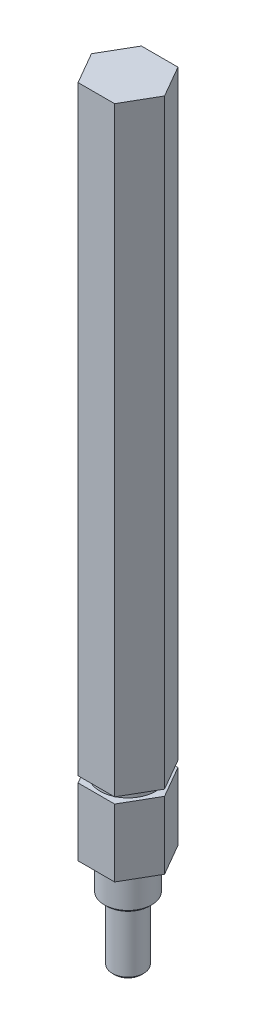
ISO-10303-21;
HEADER;
FILE_DESCRIPTION(('STEP AP214'),'2;1');
FILE_NAME('part.step','',(''),(''),'','','');
FILE_SCHEMA(('AUTOMOTIVE_DESIGN { 1 0 10303 214 1 1 1 1 }'));
ENDSEC;
DATA;
#1=APPLICATION_CONTEXT('core data for automotive mechanical design processes');
#2=APPLICATION_PROTOCOL_DEFINITION('international standard','automotive_design',2000,#1);
#3=PRODUCT_CONTEXT('',#1,'mechanical');
#4=PRODUCT('Part','Part','',(#3));
#5=PRODUCT_RELATED_PRODUCT_CATEGORY('part','',(#4));
#6=PRODUCT_DEFINITION_FORMATION('','',#4);
#7=PRODUCT_DEFINITION_CONTEXT('part definition',#1,'design');
#8=PRODUCT_DEFINITION('design','',#6,#7);
#9=PRODUCT_DEFINITION_SHAPE('','',#8);
#10=(LENGTH_UNIT() NAMED_UNIT(*) SI_UNIT(.MILLI.,.METRE.));
#11=(NAMED_UNIT(*) PLANE_ANGLE_UNIT() SI_UNIT($,.RADIAN.));
#12=(NAMED_UNIT(*) SI_UNIT($,.STERADIAN.) SOLID_ANGLE_UNIT());
#13=UNCERTAINTY_MEASURE_WITH_UNIT(LENGTH_MEASURE(1.E-05),#10,'distance_accuracy_value','');
#14=(GEOMETRIC_REPRESENTATION_CONTEXT(3) GLOBAL_UNCERTAINTY_ASSIGNED_CONTEXT((#13)) GLOBAL_UNIT_ASSIGNED_CONTEXT((#10,
#11,#12)) REPRESENTATION_CONTEXT('',''));
#15=CARTESIAN_POINT('',(0.,0.,0.));
#16=DIRECTION('',(0.,0.,1.));
#17=DIRECTION('',(1.,0.,0.));
#18=AXIS2_PLACEMENT_3D('',#15,#16,#17);
#19=CARTESIAN_POINT('',(-35.1448337161431,-92.2782,-16.6690116463021));
#20=DIRECTION('',(0.,-1.,0.));
#21=DIRECTION('',(0.,0.,-1.));
#22=AXIS2_PLACEMENT_3D('',#19,#20,#21);
#23=PLANE('',#22);
#24=CARTESIAN_POINT('',(-38.3071337161432,-92.2782000000097,-16.669011646302));
#25=DIRECTION('',(0.,1.,0.));
#26=DIRECTION('',(0.,0.,1.));
#27=AXIS2_PLACEMENT_3D('',#24,#25,#26);
#28=CIRCLE('',#27,2.65430000003342);
#29=CARTESIAN_POINT('',(-38.3071337161432,-92.2782000000097,-14.0147116462686));
#30=VERTEX_POINT('',#29);
#31=EDGE_CURVE('E19',#30,#30,#28,.T.);
#32=ORIENTED_EDGE('',*,*,#31,.F.);
#33=EDGE_LOOP('',(#32));
#34=FACE_BOUND('',#33,.T.);
#35=ADVANCED_FACE('F16',(#34),#23,.T.);
#36=CARTESIAN_POINT('',(-38.3071337161432,-91.7702000000418,-16.669011646302));
#37=DIRECTION('',(0.,1.,0.));
#38=DIRECTION('',(0.,0.,1.));
#39=AXIS2_PLACEMENT_3D('',#36,#37,#38);
#40=CONICAL_SURFACE('',#39,3.16230000000139,0.785398163397448);
#41=ORIENTED_EDGE('',*,*,#31,.T.);
#42=EDGE_LOOP('',(#41));
#43=FACE_BOUND('',#42,.T.);
#44=CARTESIAN_POINT('',(-38.3071337161432,-91.7702,-16.669011646302));
#45=DIRECTION('',(0.,1.,0.));
#46=DIRECTION('',(0.,0.,1.));
#47=AXIS2_PLACEMENT_3D('',#44,#45,#46);
#48=CIRCLE('',#47,3.1623);
#49=CARTESIAN_POINT('',(-38.3071337161432,-91.7702,-13.506711646302));
#50=VERTEX_POINT('',#49);
#51=EDGE_CURVE('E135',#50,#50,#48,.T.);
#52=ORIENTED_EDGE('',*,*,#51,.F.);
#53=EDGE_LOOP('',(#52));
#54=FACE_BOUND('',#53,.T.);
#55=ADVANCED_FACE('F160',(#43,#54),#40,.T.);
#56=CARTESIAN_POINT('',(-38.3071337161432,-92.2782,-16.669011646302));
#57=DIRECTION('',(0.,1.,0.));
#58=DIRECTION('',(0.,0.,1.));
#59=AXIS2_PLACEMENT_3D('',#56,#57,#58);
#60=CYLINDRICAL_SURFACE('',#59,3.1623);
#61=ORIENTED_EDGE('',*,*,#51,.T.);
#62=EDGE_LOOP('',(#61));
#63=FACE_BOUND('',#62,.T.);
#64=CARTESIAN_POINT('',(-38.3071337161432,-79.5782,-16.669011646302));
#65=DIRECTION('',(0.,1.,0.));
#66=DIRECTION('',(0.,0.,1.));
#67=AXIS2_PLACEMENT_3D('',#64,#65,#66);
#68=CIRCLE('',#67,3.1623);
#69=CARTESIAN_POINT('',(-38.3071337161432,-79.5782,-13.506711646302));
#70=VERTEX_POINT('',#69);
#71=EDGE_CURVE('E138',#70,#70,#68,.T.);
#72=ORIENTED_EDGE('',*,*,#71,.F.);
#73=EDGE_LOOP('',(#72));
#74=FACE_BOUND('',#73,.T.);
#75=ADVANCED_FACE('F158',(#63,#74),#60,.T.);
#76=CARTESIAN_POINT('',(-33.5573337161432,-79.5782,-16.6690116463021));
#77=DIRECTION('',(0.,-1.,0.));
#78=DIRECTION('',(0.,0.,-1.));
#79=AXIS2_PLACEMENT_3D('',#76,#77,#78);
#80=PLANE('',#79);
#81=ORIENTED_EDGE('',*,*,#71,.T.);
#82=EDGE_LOOP('',(#81));
#83=FACE_BOUND('',#82,.T.);
#84=CARTESIAN_POINT('',(-38.3071337161431,-79.5782000000145,-16.6690116463021));
#85=DIRECTION('',(0.,1.,0.));
#86=DIRECTION('',(0.,0.,1.));
#87=AXIS2_PLACEMENT_3D('',#84,#85,#86);
#88=CIRCLE('',#87,4.24180000000451);
#89=CARTESIAN_POINT('',(-38.3071337161431,-79.5782000000145,-12.4272116462976));
#90=VERTEX_POINT('',#89);
#91=EDGE_CURVE('E134',#90,#90,#88,.T.);
#92=ORIENTED_EDGE('',*,*,#91,.F.);
#93=EDGE_LOOP('',(#92));
#94=FACE_BOUND('',#93,.T.);
#95=ADVANCED_FACE('F155',(#83,#94),#80,.T.);
#96=CARTESIAN_POINT('',(-38.3071337161431,-79.0702000000465,-16.6690116463021));
#97=DIRECTION('',(0.,1.,0.));
#98=DIRECTION('',(0.,0.,1.));
#99=AXIS2_PLACEMENT_3D('',#96,#97,#98);
#100=CONICAL_SURFACE('',#99,4.74979999997249,0.785398163397448);
#101=CARTESIAN_POINT('',(-38.3071337161432,-79.0702,-16.669011646302));
#102=DIRECTION('',(0.,1.,0.));
#103=DIRECTION('',(0.,0.,1.));
#104=AXIS2_PLACEMENT_3D('',#101,#102,#103);
#105=CIRCLE('',#104,4.7498);
#106=CARTESIAN_POINT('',(-38.3071337161432,-79.0702,-11.919211646302));
#107=VERTEX_POINT('',#106);
#108=EDGE_CURVE('E131',#107,#107,#105,.T.);
#109=ORIENTED_EDGE('',*,*,#108,.F.);
#110=EDGE_LOOP('',(#109));
#111=FACE_BOUND('',#110,.T.);
#112=ORIENTED_EDGE('',*,*,#91,.T.);
#113=EDGE_LOOP('',(#112));
#114=FACE_BOUND('',#113,.T.);
#115=ADVANCED_FACE('F168',(#111,#114),#100,.T.);
#116=CARTESIAN_POINT('',(-38.3071337161432,-92.2782,-16.669011646302));
#117=DIRECTION('',(0.,1.,0.));
#118=DIRECTION('',(0.,0.,1.));
#119=AXIS2_PLACEMENT_3D('',#116,#117,#118);
#120=CYLINDRICAL_SURFACE('',#119,4.7498);
#121=CARTESIAN_POINT('',(-38.3071337161432,-72.4662,-16.669011646302));
#122=DIRECTION('',(0.,1.,0.));
#123=DIRECTION('',(0.,0.,1.));
#124=AXIS2_PLACEMENT_3D('',#121,#122,#123);
#125=CIRCLE('',#124,4.7498);
#126=CARTESIAN_POINT('',(-38.3071337161432,-72.4662,-11.919211646302));
#127=VERTEX_POINT('',#126);
#128=EDGE_CURVE('E113',#127,#127,#125,.T.);
#129=ORIENTED_EDGE('',*,*,#128,.F.);
#130=EDGE_LOOP('',(#129));
#131=FACE_BOUND('',#130,.T.);
#132=ORIENTED_EDGE('',*,*,#108,.T.);
#133=EDGE_LOOP('',(#132));
#134=FACE_BOUND('',#133,.T.);
#135=ADVANCED_FACE('F237',(#131,#134),#120,.T.);
#136=CARTESIAN_POINT('',(0.,-72.4662,0.));
#137=DIRECTION('',(0.,-1.,0.));
#138=DIRECTION('',(0.,0.,-1.));
#139=AXIS2_PLACEMENT_3D('',#136,#137,#138);
#140=PLANE('',#139);
#141=DIRECTION('',(-0.5,0.,-0.866025403784439));
#142=VECTOR('',#141,1.);
#143=CARTESIAN_POINT('',(-34.640959506789,-72.4662,-23.019011646302));
#144=LINE('',#143,#142);
#145=CARTESIAN_POINT('',(-30.974785297435,-72.4662,-16.669011646302));
#146=VERTEX_POINT('',#145);
#147=CARTESIAN_POINT('',(-34.6409595067891,-72.4662,-23.019011646302));
#148=VERTEX_POINT('',#147);
#149=EDGE_CURVE('E408',#146,#148,#144,.T.);
#150=ORIENTED_EDGE('',*,*,#149,.F.);
#151=DIRECTION('',(0.500000000000001,0.,-0.866025403784438));
#152=VECTOR('',#151,1.);
#153=CARTESIAN_POINT('',(-30.9747852974349,-72.4662,-16.6690116463021));
#154=LINE('',#153,#152);
#155=CARTESIAN_POINT('',(-34.6409595067891,-72.4662,-10.319011646302));
#156=VERTEX_POINT('',#155);
#157=EDGE_CURVE('E409',#156,#146,#154,.T.);
#158=ORIENTED_EDGE('',*,*,#157,.F.);
#159=DIRECTION('',(1.,0.,0.));
#160=VECTOR('',#159,1.);
#161=CARTESIAN_POINT('',(-34.6409595067891,-72.4662,-10.319011646302));
#162=LINE('',#161,#160);
#163=CARTESIAN_POINT('',(-41.9733079254973,-72.4662,-10.319011646302));
#164=VERTEX_POINT('',#163);
#165=EDGE_CURVE('E110',#164,#156,#162,.T.);
#166=ORIENTED_EDGE('',*,*,#165,.F.);
#167=DIRECTION('',(0.5,0.,0.866025403784439));
#168=VECTOR('',#167,1.);
#169=CARTESIAN_POINT('',(-41.9733079254973,-72.4662,-10.319011646302));
#170=LINE('',#169,#168);
#171=CARTESIAN_POINT('',(-45.6394821348515,-72.4662,-16.669011646302));
#172=VERTEX_POINT('',#171);
#173=EDGE_CURVE('E105',#172,#164,#170,.T.);
#174=ORIENTED_EDGE('',*,*,#173,.F.);
#175=DIRECTION('',(-0.5,0.,0.866025403784439));
#176=VECTOR('',#175,1.);
#177=CARTESIAN_POINT('',(-45.6394821348515,-72.4662,-16.6690116463021));
#178=LINE('',#177,#176);
#179=CARTESIAN_POINT('',(-41.9733079254973,-72.4662,-23.0190116463019));
#180=VERTEX_POINT('',#179);
#181=EDGE_CURVE('E102',#180,#172,#178,.T.);
#182=ORIENTED_EDGE('',*,*,#181,.F.);
#183=DIRECTION('',(1.,0.,0.));
#184=VECTOR('',#183,1.);
#185=CARTESIAN_POINT('',(-41.9733079254974,-72.4662,-23.0190116463019));
#186=LINE('',#185,#184);
#187=EDGE_CURVE('E122',#148,#180,#186,.F.);
#188=ORIENTED_EDGE('',*,*,#187,.F.);
#189=EDGE_LOOP('',(#150,#158,#166,#174,#182,#188));
#190=FACE_BOUND('',#189,.T.);
#191=ORIENTED_EDGE('',*,*,#128,.T.);
#192=EDGE_LOOP('',(#191));
#193=FACE_BOUND('',#192,.T.);
#194=ADVANCED_FACE('F107',(#190,#193),#140,.T.);
#195=CARTESIAN_POINT('',(-41.9733079254973,-58.928,-10.319011646302));
#196=DIRECTION('',(-0.866025403784439,0.,0.5));
#197=DIRECTION('',(0.5,0.,0.866025403784439));
#198=AXIS2_PLACEMENT_3D('',#195,#196,#197);
#199=PLANE('',#198);
#200=DIRECTION('',(-0.5,0.,-0.866025403784439));
#201=VECTOR('',#200,1.);
#202=CARTESIAN_POINT('',(-41.9733079254973,-58.928,-10.319011646302));
#203=LINE('',#202,#201);
#204=CARTESIAN_POINT('',(-41.9733079254973,-58.928,-10.319011646302));
#205=VERTEX_POINT('',#204);
#206=CARTESIAN_POINT('',(-45.6394821348515,-58.928,-16.6690116463021));
#207=VERTEX_POINT('',#206);
#208=EDGE_CURVE('E119',#205,#207,#203,.T.);
#209=ORIENTED_EDGE('',*,*,#208,.T.);
#210=DIRECTION('',(0.,1.,0.));
#211=VECTOR('',#210,1.);
#212=CARTESIAN_POINT('',(-45.6394821348515,-58.928,-16.669011646302));
#213=LINE('',#212,#211);
#214=EDGE_CURVE('E116',#172,#207,#213,.T.);
#215=ORIENTED_EDGE('',*,*,#214,.F.);
#216=ORIENTED_EDGE('',*,*,#173,.T.);
#217=DIRECTION('',(0.,-1.,0.));
#218=VECTOR('',#217,1.);
#219=CARTESIAN_POINT('',(-41.9733079254973,-58.928,-10.319011646302));
#220=LINE('',#219,#218);
#221=EDGE_CURVE('E421',#205,#164,#220,.T.);
#222=ORIENTED_EDGE('',*,*,#221,.F.);
#223=EDGE_LOOP('',(#209,#215,#216,#222));
#224=FACE_BOUND('',#223,.T.);
#225=ADVANCED_FACE('F117',(#224),#199,.T.);
#226=CARTESIAN_POINT('',(-45.6394821348515,-58.928,-16.6690116463021));
#227=DIRECTION('',(-0.866025403784439,0.,-0.5));
#228=DIRECTION('',(-0.5,0.,0.866025403784439));
#229=AXIS2_PLACEMENT_3D('',#226,#227,#228);
#230=PLANE('',#229);
#231=DIRECTION('',(0.500000000000007,0.,-0.866025403784434));
#232=VECTOR('',#231,1.);
#233=CARTESIAN_POINT('',(-45.6394821348515,-58.928,-16.6690116463021));
#234=LINE('',#233,#232);
#235=CARTESIAN_POINT('',(-41.9733079254974,-58.928,-23.0190116463019));
#236=VERTEX_POINT('',#235);
#237=EDGE_CURVE('E404',#207,#236,#234,.T.);
#238=ORIENTED_EDGE('',*,*,#237,.T.);
#239=DIRECTION('',(0.,1.,0.));
#240=VECTOR('',#239,1.);
#241=CARTESIAN_POINT('',(-41.9733079254973,-58.928,-23.0190116463019));
#242=LINE('',#241,#240);
#243=EDGE_CURVE('E126',#180,#236,#242,.T.);
#244=ORIENTED_EDGE('',*,*,#243,.F.);
#245=ORIENTED_EDGE('',*,*,#181,.T.);
#246=ORIENTED_EDGE('',*,*,#214,.T.);
#247=EDGE_LOOP('',(#238,#244,#245,#246));
#248=FACE_BOUND('',#247,.T.);
#249=ADVANCED_FACE('F124',(#248),#230,.T.);
#250=CARTESIAN_POINT('',(-41.9733079254974,-58.928,-23.0190116463019));
#251=DIRECTION('',(0.,0.,-1.));
#252=DIRECTION('',(0.,1.,0.));
#253=AXIS2_PLACEMENT_3D('',#250,#251,#252);
#254=PLANE('',#253);
#255=DIRECTION('',(1.,0.,0.));
#256=VECTOR('',#255,1.);
#257=CARTESIAN_POINT('',(-1.11022302462516E-13,-58.928,-23.0190116463019));
#258=LINE('',#257,#256);
#259=CARTESIAN_POINT('',(-34.640959506789,-58.928,-23.019011646302));
#260=VERTEX_POINT('',#259);
#261=EDGE_CURVE('E397',#236,#260,#258,.T.);
#262=ORIENTED_EDGE('',*,*,#261,.T.);
#263=DIRECTION('',(0.,1.,0.));
#264=VECTOR('',#263,1.);
#265=CARTESIAN_POINT('',(-34.6409595067891,-58.928,-23.0190116463021));
#266=LINE('',#265,#264);
#267=EDGE_CURVE('E399',#148,#260,#266,.T.);
#268=ORIENTED_EDGE('',*,*,#267,.F.);
#269=ORIENTED_EDGE('',*,*,#187,.T.);
#270=ORIENTED_EDGE('',*,*,#243,.T.);
#271=EDGE_LOOP('',(#262,#268,#269,#270));
#272=FACE_BOUND('',#271,.T.);
#273=ADVANCED_FACE('F226',(#272),#254,.T.);
#274=CARTESIAN_POINT('',(-34.640959506789,-58.928,-23.019011646302));
#275=DIRECTION('',(0.866025403784439,0.,-0.5));
#276=DIRECTION('',(-0.5,0.,-0.866025403784439));
#277=AXIS2_PLACEMENT_3D('',#274,#275,#276);
#278=PLANE('',#277);
#279=DIRECTION('',(0.500000000000001,0.,0.866025403784438));
#280=VECTOR('',#279,1.);
#281=CARTESIAN_POINT('',(-34.640959506789,-58.928,-23.019011646302));
#282=LINE('',#281,#280);
#283=CARTESIAN_POINT('',(-30.9747852974349,-58.928,-16.669011646302));
#284=VERTEX_POINT('',#283);
#285=EDGE_CURVE('E403',#260,#284,#282,.T.);
#286=ORIENTED_EDGE('',*,*,#285,.T.);
#287=DIRECTION('',(0.,1.,0.));
#288=VECTOR('',#287,1.);
#289=CARTESIAN_POINT('',(-30.974785297435,-58.928,-16.669011646302));
#290=LINE('',#289,#288);
#291=EDGE_CURVE('E427',#146,#284,#290,.T.);
#292=ORIENTED_EDGE('',*,*,#291,.F.);
#293=ORIENTED_EDGE('',*,*,#149,.T.);
#294=ORIENTED_EDGE('',*,*,#267,.T.);
#295=EDGE_LOOP('',(#286,#292,#293,#294));
#296=FACE_BOUND('',#295,.T.);
#297=ADVANCED_FACE('F222',(#296),#278,.T.);
#298=CARTESIAN_POINT('',(-30.9747852974349,-58.928,-16.6690116463021));
#299=DIRECTION('',(0.866025403784438,0.,0.500000000000001));
#300=DIRECTION('',(0.500000000000001,0.,-0.866025403784438));
#301=AXIS2_PLACEMENT_3D('',#298,#299,#300);
#302=PLANE('',#301);
#303=DIRECTION('',(-0.500000000000006,0.,0.866025403784435));
#304=VECTOR('',#303,1.);
#305=CARTESIAN_POINT('',(-30.9747852974349,-58.928,-16.6690116463021));
#306=LINE('',#305,#304);
#307=CARTESIAN_POINT('',(-34.6409595067891,-58.928,-10.319011646302));
#308=VERTEX_POINT('',#307);
#309=EDGE_CURVE('E413',#284,#308,#306,.T.);
#310=ORIENTED_EDGE('',*,*,#309,.T.);
#311=DIRECTION('',(0.,-1.,0.));
#312=VECTOR('',#311,1.);
#313=CARTESIAN_POINT('',(-34.6409595067891,-58.928,-10.319011646302));
#314=LINE('',#313,#312);
#315=EDGE_CURVE('E423',#156,#308,#314,.F.);
#316=ORIENTED_EDGE('',*,*,#315,.F.);
#317=ORIENTED_EDGE('',*,*,#157,.T.);
#318=ORIENTED_EDGE('',*,*,#291,.T.);
#319=EDGE_LOOP('',(#310,#316,#317,#318));
#320=FACE_BOUND('',#319,.T.);
#321=ADVANCED_FACE('F218',(#320),#302,.T.);
#322=CARTESIAN_POINT('',(-34.6409595067891,-58.928,-10.319011646302));
#323=DIRECTION('',(0.,0.,1.));
#324=DIRECTION('',(0.,-1.,0.));
#325=AXIS2_PLACEMENT_3D('',#322,#323,#324);
#326=PLANE('',#325);
#327=DIRECTION('',(1.,0.,0.));
#328=VECTOR('',#327,1.);
#329=CARTESIAN_POINT('',(-1.11022302462516E-13,-58.928,-10.319011646302));
#330=LINE('',#329,#328);
#331=EDGE_CURVE('E415',#308,#205,#330,.F.);
#332=ORIENTED_EDGE('',*,*,#331,.T.);
#333=ORIENTED_EDGE('',*,*,#221,.T.);
#334=ORIENTED_EDGE('',*,*,#165,.T.);
#335=ORIENTED_EDGE('',*,*,#315,.T.);
#336=EDGE_LOOP('',(#332,#333,#334,#335));
#337=FACE_BOUND('',#336,.T.);
#338=ADVANCED_FACE('F214',(#337),#326,.T.);
#339=CARTESIAN_POINT('',(-1.11022302462516E-13,-58.928,0.));
#340=DIRECTION('',(0.,-1.,0.));
#341=DIRECTION('',(0.,0.,-1.));
#342=AXIS2_PLACEMENT_3D('',#339,#340,#341);
#343=PLANE('',#342);
#344=CARTESIAN_POINT('',(-38.3071337161432,-58.928,-16.6690116463021));
#345=DIRECTION('',(0.,-1.,0.));
#346=DIRECTION('',(0.,0.,-1.));
#347=AXIS2_PLACEMENT_3D('',#344,#345,#346);
#348=CIRCLE('',#347,5.58800000000002);
#349=CARTESIAN_POINT('',(-38.3071337161432,-58.928,-22.2570116463021));
#350=VERTEX_POINT('',#349);
#351=EDGE_CURVE('E144',#350,#350,#348,.F.);
#352=ORIENTED_EDGE('',*,*,#351,.F.);
#353=EDGE_LOOP('',(#352));
#354=FACE_BOUND('',#353,.T.);
#355=ORIENTED_EDGE('',*,*,#309,.F.);
#356=ORIENTED_EDGE('',*,*,#285,.F.);
#357=ORIENTED_EDGE('',*,*,#261,.F.);
#358=ORIENTED_EDGE('',*,*,#237,.F.);
#359=ORIENTED_EDGE('',*,*,#208,.F.);
#360=ORIENTED_EDGE('',*,*,#331,.F.);
#361=EDGE_LOOP('',(#355,#356,#357,#358,#359,#360));
#362=FACE_BOUND('',#361,.T.);
#363=ADVANCED_FACE('F210',(#354,#362),#343,.F.);
#364=CARTESIAN_POINT('',(-41.9733079254974,87.2998,-10.319011646302));
#365=DIRECTION('',(-0.866025403784438,0.,0.5));
#366=DIRECTION('',(0.5,0.,0.866025403784438));
#367=AXIS2_PLACEMENT_3D('',#364,#365,#366);
#368=PLANE('',#367);
#369=DIRECTION('',(-0.5,0.,-0.866025403784439));
#370=VECTOR('',#369,1.);
#371=CARTESIAN_POINT('',(-41.9733079254973,-57.6834,-10.319011646302));
#372=LINE('',#371,#370);
#373=CARTESIAN_POINT('',(-41.9733079254973,-57.6834,-10.319011646302));
#374=VERTEX_POINT('',#373);
#375=CARTESIAN_POINT('',(-45.6394821348515,-57.6834,-16.669011646302));
#376=VERTEX_POINT('',#375);
#377=EDGE_CURVE('E453',#374,#376,#372,.T.);
#378=ORIENTED_EDGE('',*,*,#377,.F.);
#379=DIRECTION('',(0.,-1.,0.));
#380=VECTOR('',#379,1.);
#381=CARTESIAN_POINT('',(-41.9733079254973,87.2998,-10.3190116463021));
#382=LINE('',#381,#380);
#383=CARTESIAN_POINT('',(-41.9733079254972,62.7151400000006,-10.3190116463018));
#384=VERTEX_POINT('',#383);
#385=EDGE_CURVE('E448',#384,#374,#382,.T.);
#386=ORIENTED_EDGE('',*,*,#385,.F.);
#387=DIRECTION('',(-0.499999999999992,0.,-0.866025403784443));
#388=VECTOR('',#387,1.);
#389=CARTESIAN_POINT('',(-41.9733079254973,62.7151400000006,-10.3190116463018));
#390=LINE('',#389,#388);
#391=CARTESIAN_POINT('',(-45.6394821348515,62.7151400000006,-16.669011646302));
#392=VERTEX_POINT('',#391);
#393=EDGE_CURVE('E439',#384,#392,#390,.T.);
#394=ORIENTED_EDGE('',*,*,#393,.T.);
#395=DIRECTION('',(0.,1.,0.));
#396=VECTOR('',#395,1.);
#397=CARTESIAN_POINT('',(-45.6394821348514,87.2998,-16.6690116463021));
#398=LINE('',#397,#396);
#399=EDGE_CURVE('E148',#376,#392,#398,.T.);
#400=ORIENTED_EDGE('',*,*,#399,.F.);
#401=EDGE_LOOP('',(#378,#386,#394,#400));
#402=FACE_BOUND('',#401,.T.);
#403=ADVANCED_FACE('F206',(#402),#368,.T.);
#404=CARTESIAN_POINT('',(-45.6394821348514,87.2998,-16.6690116463021));
#405=DIRECTION('',(-0.866025403784439,0.,-0.5));
#406=DIRECTION('',(-0.5,0.,0.866025403784439));
#407=AXIS2_PLACEMENT_3D('',#404,#405,#406);
#408=PLANE('',#407);
#409=DIRECTION('',(0.500000000000007,0.,-0.866025403784434));
#410=VECTOR('',#409,1.);
#411=CARTESIAN_POINT('',(-45.6394821348515,-57.6834,-16.6690116463021));
#412=LINE('',#411,#410);
#413=CARTESIAN_POINT('',(-41.9733079254973,-57.6834,-23.019011646302));
#414=VERTEX_POINT('',#413);
#415=EDGE_CURVE('E456',#376,#414,#412,.T.);
#416=ORIENTED_EDGE('',*,*,#415,.F.);
#417=ORIENTED_EDGE('',*,*,#399,.T.);
#418=DIRECTION('',(0.500000000000012,0.,-0.866025403784432));
#419=VECTOR('',#418,1.);
#420=CARTESIAN_POINT('',(-45.6394821348515,62.7151400000006,-16.6690116463021));
#421=LINE('',#420,#419);
#422=CARTESIAN_POINT('',(-41.9733079254973,62.7151400000006,-23.0190116463021));
#423=VERTEX_POINT('',#422);
#424=EDGE_CURVE('E441',#392,#423,#421,.T.);
#425=ORIENTED_EDGE('',*,*,#424,.T.);
#426=DIRECTION('',(0.,1.,0.));
#427=VECTOR('',#426,1.);
#428=CARTESIAN_POINT('',(-41.9733079254974,87.2998,-23.019011646302));
#429=LINE('',#428,#427);
#430=EDGE_CURVE('E147',#414,#423,#429,.T.);
#431=ORIENTED_EDGE('',*,*,#430,.F.);
#432=EDGE_LOOP('',(#416,#417,#425,#431));
#433=FACE_BOUND('',#432,.T.);
#434=ADVANCED_FACE('F202',(#433),#408,.T.);
#435=CARTESIAN_POINT('',(-38.3071337161432,-57.4294,-16.6690116463021));
#436=DIRECTION('',(0.,-1.,0.));
#437=DIRECTION('',(0.,0.,-1.));
#438=AXIS2_PLACEMENT_3D('',#435,#436,#437);
#439=CYLINDRICAL_SURFACE('',#438,5.58800000000002);
#440=CARTESIAN_POINT('',(-38.3071337161432,-57.6834,-16.6690116463021));
#441=DIRECTION('',(0.,-1.,0.));
#442=DIRECTION('',(0.,0.,-1.));
#443=AXIS2_PLACEMENT_3D('',#440,#441,#442);
#444=CIRCLE('',#443,5.58800000000002);
#445=CARTESIAN_POINT('',(-38.3071337161432,-57.6834,-22.2570116463021));
#446=VERTEX_POINT('',#445);
#447=EDGE_CURVE('E139',#446,#446,#444,.F.);
#448=ORIENTED_EDGE('',*,*,#447,.F.);
#449=EDGE_LOOP('',(#448));
#450=FACE_BOUND('',#449,.T.);
#451=ORIENTED_EDGE('',*,*,#351,.T.);
#452=EDGE_LOOP('',(#451));
#453=FACE_BOUND('',#452,.T.);
#454=ADVANCED_FACE('F198',(#450,#453),#439,.T.);
#455=CARTESIAN_POINT('',(-41.9733079254974,87.2998,-23.019011646302));
#456=DIRECTION('',(0.,0.,-1.));
#457=DIRECTION('',(0.,1.,0.));
#458=AXIS2_PLACEMENT_3D('',#455,#456,#457);
#459=PLANE('',#458);
#460=DIRECTION('',(1.,0.,0.));
#461=VECTOR('',#460,1.);
#462=CARTESIAN_POINT('',(-1.11022302462516E-13,-57.6834,-23.0190116463019));
#463=LINE('',#462,#461);
#464=CARTESIAN_POINT('',(-34.640959506789,-57.6834,-23.019011646302));
#465=VERTEX_POINT('',#464);
#466=EDGE_CURVE('E143',#414,#465,#463,.T.);
#467=ORIENTED_EDGE('',*,*,#466,.F.);
#468=ORIENTED_EDGE('',*,*,#430,.T.);
#469=DIRECTION('',(1.,0.,0.));
#470=VECTOR('',#469,1.);
#471=CARTESIAN_POINT('',(-45.5596495681795,62.7151400000006,-23.019011646302));
#472=LINE('',#471,#470);
#473=CARTESIAN_POINT('',(-34.640959506789,62.7151400000006,-23.019011646302));
#474=VERTEX_POINT('',#473);
#475=EDGE_CURVE('E443',#423,#474,#472,.T.);
#476=ORIENTED_EDGE('',*,*,#475,.T.);
#477=DIRECTION('',(0.,1.,0.));
#478=VECTOR('',#477,1.);
#479=CARTESIAN_POINT('',(-34.640959506789,87.2998,-23.019011646302));
#480=LINE('',#479,#478);
#481=EDGE_CURVE('E463',#465,#474,#480,.T.);
#482=ORIENTED_EDGE('',*,*,#481,.F.);
#483=EDGE_LOOP('',(#467,#468,#476,#482));
#484=FACE_BOUND('',#483,.T.);
#485=ADVANCED_FACE('F194',(#484),#459,.T.);
#486=CARTESIAN_POINT('',(-45.5596495681795,62.7151400000002,97.508612380543));
#487=DIRECTION('',(0.,-1.,0.));
#488=DIRECTION('',(0.,0.,-1.));
#489=AXIS2_PLACEMENT_3D('',#486,#487,#488);
#490=PLANE('',#489);
#491=DIRECTION('',(0.500000000000001,0.,-0.866025403784438));
#492=VECTOR('',#491,1.);
#493=CARTESIAN_POINT('',(-30.9747852974349,62.7151400000006,-16.6690116463021));
#494=LINE('',#493,#492);
#495=CARTESIAN_POINT('',(-30.9747852974348,62.7151400000006,-16.6690116463018));
#496=VERTEX_POINT('',#495);
#497=CARTESIAN_POINT('',(-34.6409595067893,62.7151400000006,-10.3190116463017));
#498=VERTEX_POINT('',#497);
#499=EDGE_CURVE('E466',#496,#498,#494,.F.);
#500=ORIENTED_EDGE('',*,*,#499,.F.);
#501=DIRECTION('',(-0.5,0.,-0.866025403784439));
#502=VECTOR('',#501,1.);
#503=CARTESIAN_POINT('',(-34.640959506789,62.7151400000006,-23.019011646302));
#504=LINE('',#503,#502);
#505=EDGE_CURVE('E142',#474,#496,#504,.F.);
#506=ORIENTED_EDGE('',*,*,#505,.F.);
#507=ORIENTED_EDGE('',*,*,#475,.F.);
#508=ORIENTED_EDGE('',*,*,#424,.F.);
#509=ORIENTED_EDGE('',*,*,#393,.F.);
#510=DIRECTION('',(1.,0.,0.));
#511=VECTOR('',#510,1.);
#512=CARTESIAN_POINT('',(-34.6409595067891,62.7151400000006,-10.3190116463021));
#513=LINE('',#512,#511);
#514=EDGE_CURVE('E445',#498,#384,#513,.F.);
#515=ORIENTED_EDGE('',*,*,#514,.F.);
#516=EDGE_LOOP('',(#500,#506,#507,#508,#509,#515));
#517=FACE_BOUND('',#516,.T.);
#518=ADVANCED_FACE('F190',(#517),#490,.F.);
#519=CARTESIAN_POINT('',(-34.6409595067891,87.2998,-10.3190116463021));
#520=DIRECTION('',(0.,0.,1.));
#521=DIRECTION('',(0.,-1.,0.));
#522=AXIS2_PLACEMENT_3D('',#519,#520,#521);
#523=PLANE('',#522);
#524=DIRECTION('',(1.,0.,0.));
#525=VECTOR('',#524,1.);
#526=CARTESIAN_POINT('',(-1.11022302462516E-13,-57.6834,-10.319011646302));
#527=LINE('',#526,#525);
#528=CARTESIAN_POINT('',(-34.6409595067892,-57.6834,-10.3190116463019));
#529=VERTEX_POINT('',#528);
#530=EDGE_CURVE('E450',#529,#374,#527,.F.);
#531=ORIENTED_EDGE('',*,*,#530,.F.);
#532=DIRECTION('',(0.,1.,0.));
#533=VECTOR('',#532,1.);
#534=CARTESIAN_POINT('',(-34.6409595067894,87.2998,-10.3190116463016));
#535=LINE('',#534,#533);
#536=EDGE_CURVE('E469',#498,#529,#535,.F.);
#537=ORIENTED_EDGE('',*,*,#536,.F.);
#538=ORIENTED_EDGE('',*,*,#514,.T.);
#539=ORIENTED_EDGE('',*,*,#385,.T.);
#540=EDGE_LOOP('',(#531,#537,#538,#539));
#541=FACE_BOUND('',#540,.T.);
#542=ADVANCED_FACE('F186',(#541),#523,.T.);
#543=CARTESIAN_POINT('',(-1.11022302462516E-13,-57.6834,0.));
#544=DIRECTION('',(0.,-1.,0.));
#545=DIRECTION('',(0.,0.,-1.));
#546=AXIS2_PLACEMENT_3D('',#543,#544,#545);
#547=PLANE('',#546);
#548=ORIENTED_EDGE('',*,*,#447,.T.);
#549=EDGE_LOOP('',(#548));
#550=FACE_BOUND('',#549,.T.);
#551=DIRECTION('',(-0.5,0.,-0.866025403784439));
#552=VECTOR('',#551,1.);
#553=CARTESIAN_POINT('',(-34.640959506789,-57.6834000000001,-23.019011646302));
#554=LINE('',#553,#552);
#555=CARTESIAN_POINT('',(-30.9747852974349,-57.6834,-16.669011646302));
#556=VERTEX_POINT('',#555);
#557=EDGE_CURVE('E34',#556,#465,#554,.T.);
#558=ORIENTED_EDGE('',*,*,#557,.F.);
#559=DIRECTION('',(0.500000000000001,0.,-0.866025403784438));
#560=VECTOR('',#559,1.);
#561=CARTESIAN_POINT('',(-30.9747852974349,-57.6834,-16.6690116463021));
#562=LINE('',#561,#560);
#563=EDGE_CURVE('E25',#529,#556,#562,.T.);
#564=ORIENTED_EDGE('',*,*,#563,.F.);
#565=ORIENTED_EDGE('',*,*,#530,.T.);
#566=ORIENTED_EDGE('',*,*,#377,.T.);
#567=ORIENTED_EDGE('',*,*,#415,.T.);
#568=ORIENTED_EDGE('',*,*,#466,.T.);
#569=EDGE_LOOP('',(#558,#564,#565,#566,#567,#568));
#570=FACE_BOUND('',#569,.T.);
#571=ADVANCED_FACE('F179',(#550,#570),#547,.T.);
#572=CARTESIAN_POINT('',(-34.640959506789,87.2998,-23.019011646302));
#573=DIRECTION('',(0.866025403784439,0.,-0.5));
#574=DIRECTION('',(-0.5,0.,-0.866025403784439));
#575=AXIS2_PLACEMENT_3D('',#572,#573,#574);
#576=PLANE('',#575);
#577=ORIENTED_EDGE('',*,*,#557,.T.);
#578=ORIENTED_EDGE('',*,*,#481,.T.);
#579=ORIENTED_EDGE('',*,*,#505,.T.);
#580=DIRECTION('',(0.,1.,0.));
#581=VECTOR('',#580,1.);
#582=CARTESIAN_POINT('',(-30.9747852974349,87.2998,-16.6690116463021));
#583=LINE('',#582,#581);
#584=EDGE_CURVE('E10',#556,#496,#583,.T.);
#585=ORIENTED_EDGE('',*,*,#584,.F.);
#586=EDGE_LOOP('',(#577,#578,#579,#585));
#587=FACE_BOUND('',#586,.T.);
#588=ADVANCED_FACE('F173',(#587),#576,.T.);
#589=CARTESIAN_POINT('',(-30.9747852974349,87.2998,-16.6690116463021));
#590=DIRECTION('',(0.866025403784438,0.,0.500000000000001));
#591=DIRECTION('',(0.500000000000001,0.,-0.866025403784438));
#592=AXIS2_PLACEMENT_3D('',#589,#590,#591);
#593=PLANE('',#592);
#594=ORIENTED_EDGE('',*,*,#563,.T.);
#595=ORIENTED_EDGE('',*,*,#584,.T.);
#596=ORIENTED_EDGE('',*,*,#499,.T.);
#597=ORIENTED_EDGE('',*,*,#536,.T.);
#598=EDGE_LOOP('',(#594,#595,#596,#597));
#599=FACE_BOUND('',#598,.T.);
#600=ADVANCED_FACE('F171',(#599),#593,.T.);
#601=CLOSED_SHELL('',(#35,#55,#75,#95,#115,#135,#194,#225,#249,#273,#297,#321,#338,#363,#403,
#434,#454,#485,#518,#542,#571,#588,#600));
#602=MANIFOLD_SOLID_BREP('B1',#601);
#603=ADVANCED_BREP_SHAPE_REPRESENTATION('',(#18,#602),#14);
#604=SHAPE_DEFINITION_REPRESENTATION(#9,#603);
ENDSEC;
END-ISO-10303-21;
